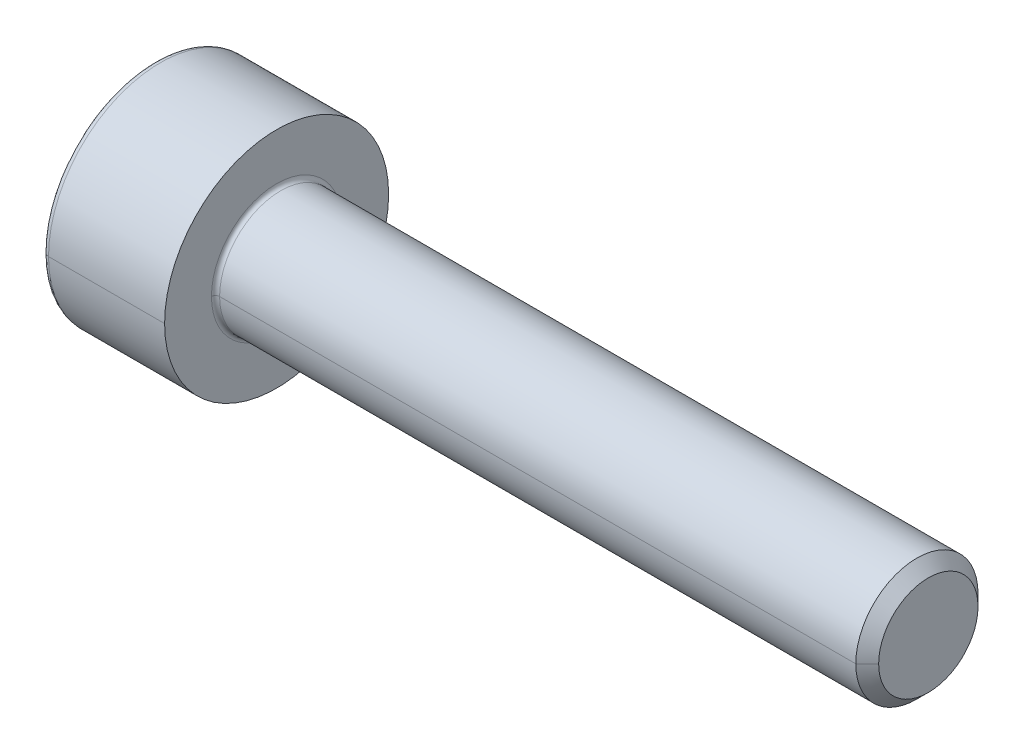
ISO-10303-21;
HEADER;
FILE_DESCRIPTION(('STEP AP214'),'2;1');
FILE_NAME('part.step','',(''),(''),'','','');
FILE_SCHEMA(('AUTOMOTIVE_DESIGN { 1 0 10303 214 1 1 1 1 }'));
ENDSEC;
DATA;
#1=APPLICATION_CONTEXT('core data for automotive mechanical design processes');
#2=APPLICATION_PROTOCOL_DEFINITION('international standard','automotive_design',2000,#1);
#3=PRODUCT_CONTEXT('',#1,'mechanical');
#4=PRODUCT('Part','Part','',(#3));
#5=PRODUCT_RELATED_PRODUCT_CATEGORY('part','',(#4));
#6=PRODUCT_DEFINITION_FORMATION('','',#4);
#7=PRODUCT_DEFINITION_CONTEXT('part definition',#1,'design');
#8=PRODUCT_DEFINITION('design','',#6,#7);
#9=PRODUCT_DEFINITION_SHAPE('','',#8);
#10=(LENGTH_UNIT() NAMED_UNIT(*) SI_UNIT(.MILLI.,.METRE.));
#11=(NAMED_UNIT(*) PLANE_ANGLE_UNIT() SI_UNIT($,.RADIAN.));
#12=(NAMED_UNIT(*) SI_UNIT($,.STERADIAN.) SOLID_ANGLE_UNIT());
#13=UNCERTAINTY_MEASURE_WITH_UNIT(LENGTH_MEASURE(1.E-05),#10,'distance_accuracy_value','');
#14=(GEOMETRIC_REPRESENTATION_CONTEXT(3) GLOBAL_UNCERTAINTY_ASSIGNED_CONTEXT((#13)) GLOBAL_UNIT_ASSIGNED_CONTEXT((#10,
#11,#12)) REPRESENTATION_CONTEXT('',''));
#15=CARTESIAN_POINT('',(0.,0.,0.));
#16=DIRECTION('',(0.,0.,1.));
#17=DIRECTION('',(1.,0.,0.));
#18=AXIS2_PLACEMENT_3D('',#15,#16,#17);
#19=CARTESIAN_POINT('',(1.3,0.,0.));
#20=DIRECTION('',(-1.,0.,0.));
#21=DIRECTION('',(0.,0.,1.));
#22=AXIS2_PLACEMENT_3D('',#19,#20,#21);
#23=CONICAL_SURFACE('',#22,1.28,1.0471975511966);
#24=DIRECTION('',(-0.5,0.,-0.866025403784437));
#25=VECTOR('',#24,1.);
#26=CARTESIAN_POINT('',(1.3,0.,-1.28));
#27=LINE('',#26,#25);
#28=CARTESIAN_POINT('',(2.03900834456273,0.,0.));
#29=VERTEX_POINT('',#28);
#30=CARTESIAN_POINT('',(1.3,0.,-1.28));
#31=VERTEX_POINT('',#30);
#32=EDGE_CURVE('E303',#29,#31,#27,.T.);
#33=ORIENTED_EDGE('',*,*,#32,.F.);
#34=DIRECTION('',(-0.5,0.,0.866025403784437));
#35=VECTOR('',#34,1.);
#36=CARTESIAN_POINT('',(1.3,0.,1.28));
#37=LINE('',#36,#35);
#38=CARTESIAN_POINT('',(1.3,0.,1.28));
#39=VERTEX_POINT('',#38);
#40=EDGE_CURVE('E301',#29,#39,#37,.T.);
#41=ORIENTED_EDGE('',*,*,#40,.T.);
#42=CARTESIAN_POINT('',(1.3,0.,0.));
#43=DIRECTION('',(-1.,0.,0.));
#44=DIRECTION('',(0.,0.,1.));
#45=AXIS2_PLACEMENT_3D('',#42,#43,#44);
#46=CIRCLE('',#45,1.28);
#47=CARTESIAN_POINT('',(1.3,1.10851251684408,0.64));
#48=VERTEX_POINT('',#47);
#49=EDGE_CURVE('E19',#39,#48,#46,.T.);
#50=ORIENTED_EDGE('',*,*,#49,.T.);
#51=CARTESIAN_POINT('',(1.3,0.,0.));
#52=DIRECTION('',(-1.,0.,0.));
#53=DIRECTION('',(0.,0.,1.));
#54=AXIS2_PLACEMENT_3D('',#51,#52,#53);
#55=CIRCLE('',#54,1.28);
#56=CARTESIAN_POINT('',(1.3,1.10851251684408,-0.64));
#57=VERTEX_POINT('',#56);
#58=EDGE_CURVE('E25',#48,#57,#55,.T.);
#59=ORIENTED_EDGE('',*,*,#58,.T.);
#60=CARTESIAN_POINT('',(1.3,0.,0.));
#61=DIRECTION('',(-1.,0.,0.));
#62=DIRECTION('',(0.,0.,1.));
#63=AXIS2_PLACEMENT_3D('',#60,#61,#62);
#64=CIRCLE('',#63,1.28);
#65=EDGE_CURVE('E11',#57,#31,#64,.T.);
#66=ORIENTED_EDGE('',*,*,#65,.T.);
#67=EDGE_LOOP('',(#33,#41,#50,#59,#66));
#68=FACE_BOUND('',#67,.T.);
#69=ADVANCED_FACE('F16',(#68),#23,.F.);
#70=CARTESIAN_POINT('',(1.3,1.47801668912544,0.));
#71=DIRECTION('',(1.,0.,0.));
#72=DIRECTION('',(0.,1.,0.));
#73=AXIS2_PLACEMENT_3D('',#70,#71,#72);
#74=PLANE('',#73);
#75=DIRECTION('',(0.,-0.5,-0.866025403784438));
#76=VECTOR('',#75,1.);
#77=CARTESIAN_POINT('',(1.3,1.47801668912544,0.));
#78=LINE('',#77,#76);
#79=CARTESIAN_POINT('',(1.3,0.739008344562716,-1.28));
#80=VERTEX_POINT('',#79);
#81=EDGE_CURVE('E46',#57,#80,#78,.T.);
#82=ORIENTED_EDGE('',*,*,#81,.T.);
#83=DIRECTION('',(0.,-1.,0.));
#84=VECTOR('',#83,1.);
#85=CARTESIAN_POINT('',(1.3,0.739008344562716,-1.28));
#86=LINE('',#85,#84);
#87=EDGE_CURVE('E193',#80,#31,#86,.T.);
#88=ORIENTED_EDGE('',*,*,#87,.T.);
#89=ORIENTED_EDGE('',*,*,#65,.F.);
#90=EDGE_LOOP('',(#82,#88,#89));
#91=FACE_BOUND('',#90,.T.);
#92=ADVANCED_FACE('F412',(#91),#74,.F.);
#93=CARTESIAN_POINT('',(1.3,1.47801668912544,0.));
#94=DIRECTION('',(1.,0.,0.));
#95=DIRECTION('',(0.,1.,0.));
#96=AXIS2_PLACEMENT_3D('',#93,#94,#95);
#97=PLANE('',#96);
#98=DIRECTION('',(0.,-0.5,0.866025403784439));
#99=VECTOR('',#98,1.);
#100=CARTESIAN_POINT('',(1.3,1.47801668912544,0.));
#101=LINE('',#100,#99);
#102=CARTESIAN_POINT('',(1.3,1.47801668912544,0.));
#103=VERTEX_POINT('',#102);
#104=EDGE_CURVE('E230',#103,#48,#101,.T.);
#105=ORIENTED_EDGE('',*,*,#104,.F.);
#106=DIRECTION('',(0.,-0.5,-0.866025403784438));
#107=VECTOR('',#106,1.);
#108=CARTESIAN_POINT('',(1.3,1.47801668912544,0.));
#109=LINE('',#108,#107);
#110=EDGE_CURVE('E201',#103,#57,#109,.T.);
#111=ORIENTED_EDGE('',*,*,#110,.T.);
#112=ORIENTED_EDGE('',*,*,#58,.F.);
#113=EDGE_LOOP('',(#105,#111,#112));
#114=FACE_BOUND('',#113,.T.);
#115=ADVANCED_FACE('F417',(#114),#97,.F.);
#116=CARTESIAN_POINT('',(1.3,1.47801668912544,0.));
#117=DIRECTION('',(1.,0.,0.));
#118=DIRECTION('',(0.,1.,0.));
#119=AXIS2_PLACEMENT_3D('',#116,#117,#118);
#120=PLANE('',#119);
#121=DIRECTION('',(0.,1.,0.));
#122=VECTOR('',#121,1.);
#123=CARTESIAN_POINT('',(1.3,-0.739008344562723,1.28));
#124=LINE('',#123,#122);
#125=CARTESIAN_POINT('',(1.3,0.739008344562719,1.28));
#126=VERTEX_POINT('',#125);
#127=EDGE_CURVE('E277',#39,#126,#124,.T.);
#128=ORIENTED_EDGE('',*,*,#127,.T.);
#129=DIRECTION('',(0.,-0.5,0.866025403784439));
#130=VECTOR('',#129,1.);
#131=CARTESIAN_POINT('',(1.3,1.47801668912544,0.));
#132=LINE('',#131,#130);
#133=EDGE_CURVE('E234',#48,#126,#132,.T.);
#134=ORIENTED_EDGE('',*,*,#133,.F.);
#135=ORIENTED_EDGE('',*,*,#49,.F.);
#136=EDGE_LOOP('',(#128,#134,#135));
#137=FACE_BOUND('',#136,.T.);
#138=ADVANCED_FACE('F624',(#137),#120,.F.);
#139=CARTESIAN_POINT('',(1.3,1.47801668912544,0.));
#140=DIRECTION('',(1.,0.,0.));
#141=DIRECTION('',(0.,1.,0.));
#142=AXIS2_PLACEMENT_3D('',#139,#140,#141);
#143=PLANE('',#142);
#144=DIRECTION('',(0.,-0.5,-0.866025403784438));
#145=VECTOR('',#144,1.);
#146=CARTESIAN_POINT('',(1.3,-0.739008344562723,1.28));
#147=LINE('',#146,#145);
#148=CARTESIAN_POINT('',(1.3,-0.739008344562723,1.28));
#149=VERTEX_POINT('',#148);
#150=CARTESIAN_POINT('',(1.3,-1.10851251684408,0.64));
#151=VERTEX_POINT('',#150);
#152=EDGE_CURVE('E172',#149,#151,#147,.T.);
#153=ORIENTED_EDGE('',*,*,#152,.F.);
#154=DIRECTION('',(0.,1.,0.));
#155=VECTOR('',#154,1.);
#156=CARTESIAN_POINT('',(1.3,-0.739008344562723,1.28));
#157=LINE('',#156,#155);
#158=EDGE_CURVE('E280',#149,#39,#157,.T.);
#159=ORIENTED_EDGE('',*,*,#158,.T.);
#160=CARTESIAN_POINT('',(1.3,0.,0.));
#161=DIRECTION('',(-1.,0.,0.));
#162=DIRECTION('',(0.,0.,1.));
#163=AXIS2_PLACEMENT_3D('',#160,#161,#162);
#164=CIRCLE('',#163,1.28);
#165=EDGE_CURVE('E304',#151,#39,#164,.T.);
#166=ORIENTED_EDGE('',*,*,#165,.F.);
#167=EDGE_LOOP('',(#153,#159,#166));
#168=FACE_BOUND('',#167,.T.);
#169=ADVANCED_FACE('F430',(#168),#143,.F.);
#170=CARTESIAN_POINT('',(1.3,1.47801668912544,0.));
#171=DIRECTION('',(1.,0.,0.));
#172=DIRECTION('',(0.,1.,0.));
#173=AXIS2_PLACEMENT_3D('',#170,#171,#172);
#174=PLANE('',#173);
#175=DIRECTION('',(0.,0.5,-0.866025403784439));
#176=VECTOR('',#175,1.);
#177=CARTESIAN_POINT('',(1.3,-1.47801668912544,0.));
#178=LINE('',#177,#176);
#179=CARTESIAN_POINT('',(1.3,-1.47801668912544,0.));
#180=VERTEX_POINT('',#179);
#181=CARTESIAN_POINT('',(1.3,-1.10851251684409,-0.64));
#182=VERTEX_POINT('',#181);
#183=EDGE_CURVE('E145',#180,#182,#178,.T.);
#184=ORIENTED_EDGE('',*,*,#183,.F.);
#185=DIRECTION('',(0.,-0.5,-0.866025403784438));
#186=VECTOR('',#185,1.);
#187=CARTESIAN_POINT('',(1.3,-0.739008344562723,1.28));
#188=LINE('',#187,#186);
#189=EDGE_CURVE('E149',#151,#180,#188,.T.);
#190=ORIENTED_EDGE('',*,*,#189,.F.);
#191=CARTESIAN_POINT('',(1.3,0.,0.));
#192=DIRECTION('',(-1.,0.,0.));
#193=DIRECTION('',(0.,0.,1.));
#194=AXIS2_PLACEMENT_3D('',#191,#192,#193);
#195=CIRCLE('',#194,1.28);
#196=EDGE_CURVE('E153',#182,#151,#195,.T.);
#197=ORIENTED_EDGE('',*,*,#196,.F.);
#198=EDGE_LOOP('',(#184,#190,#197));
#199=FACE_BOUND('',#198,.T.);
#200=ADVANCED_FACE('F147',(#199),#174,.F.);
#201=CARTESIAN_POINT('',(1.3,1.47801668912544,0.));
#202=DIRECTION('',(1.,0.,0.));
#203=DIRECTION('',(0.,1.,0.));
#204=AXIS2_PLACEMENT_3D('',#201,#202,#203);
#205=PLANE('',#204);
#206=DIRECTION('',(0.,-1.,0.));
#207=VECTOR('',#206,1.);
#208=CARTESIAN_POINT('',(1.3,0.739008344562716,-1.28));
#209=LINE('',#208,#207);
#210=CARTESIAN_POINT('',(1.3,-0.739008344562726,-1.28));
#211=VERTEX_POINT('',#210);
#212=EDGE_CURVE('E190',#31,#211,#209,.T.);
#213=ORIENTED_EDGE('',*,*,#212,.T.);
#214=DIRECTION('',(0.,0.5,-0.866025403784439));
#215=VECTOR('',#214,1.);
#216=CARTESIAN_POINT('',(1.3,-1.47801668912544,0.));
#217=LINE('',#216,#215);
#218=EDGE_CURVE('E158',#182,#211,#217,.T.);
#219=ORIENTED_EDGE('',*,*,#218,.F.);
#220=CARTESIAN_POINT('',(1.3,0.,0.));
#221=DIRECTION('',(-1.,0.,0.));
#222=DIRECTION('',(0.,0.,1.));
#223=AXIS2_PLACEMENT_3D('',#220,#221,#222);
#224=CIRCLE('',#223,1.28);
#225=EDGE_CURVE('E312',#31,#182,#224,.T.);
#226=ORIENTED_EDGE('',*,*,#225,.F.);
#227=EDGE_LOOP('',(#213,#219,#226));
#228=FACE_BOUND('',#227,.T.);
#229=ADVANCED_FACE('F641',(#228),#205,.F.);
#230=CARTESIAN_POINT('',(1.3,1.47801668912544,0.));
#231=DIRECTION('',(0.,0.866025403784438,-0.5));
#232=DIRECTION('',(-1.,0.,0.));
#233=AXIS2_PLACEMENT_3D('',#230,#231,#232);
#234=PLANE('',#233);
#235=DIRECTION('',(0.,-0.5,-0.866025403784438));
#236=VECTOR('',#235,1.);
#237=CARTESIAN_POINT('',(0.,1.47801668912544,0.));
#238=LINE('',#237,#236);
#239=CARTESIAN_POINT('',(0.,1.47801668912544,0.));
#240=VERTEX_POINT('',#239);
#241=CARTESIAN_POINT('',(0.,0.739008344562716,-1.28));
#242=VERTEX_POINT('',#241);
#243=EDGE_CURVE('E252',#240,#242,#238,.T.);
#244=ORIENTED_EDGE('',*,*,#243,.T.);
#245=DIRECTION('',(-1.,0.,0.));
#246=VECTOR('',#245,1.);
#247=CARTESIAN_POINT('',(1.3,0.739008344562716,-1.28));
#248=LINE('',#247,#246);
#249=EDGE_CURVE('E196',#80,#242,#248,.T.);
#250=ORIENTED_EDGE('',*,*,#249,.F.);
#251=ORIENTED_EDGE('',*,*,#81,.F.);
#252=ORIENTED_EDGE('',*,*,#110,.F.);
#253=DIRECTION('',(-1.,0.,0.));
#254=VECTOR('',#253,1.);
#255=CARTESIAN_POINT('',(1.3,1.47801668912544,0.));
#256=LINE('',#255,#254);
#257=EDGE_CURVE('E235',#103,#240,#256,.T.);
#258=ORIENTED_EDGE('',*,*,#257,.T.);
#259=EDGE_LOOP('',(#244,#250,#251,#252,#258));
#260=FACE_BOUND('',#259,.T.);
#261=ADVANCED_FACE('F650',(#260),#234,.F.);
#262=CARTESIAN_POINT('',(1.3,0.739008344562716,-1.28));
#263=DIRECTION('',(0.,0.,-1.));
#264=DIRECTION('',(0.,-1.,0.));
#265=AXIS2_PLACEMENT_3D('',#262,#263,#264);
#266=PLANE('',#265);
#267=DIRECTION('',(0.,-1.,0.));
#268=VECTOR('',#267,1.);
#269=CARTESIAN_POINT('',(0.,0.739008344562716,-1.28));
#270=LINE('',#269,#268);
#271=CARTESIAN_POINT('',(0.,-0.739008344562726,-1.28));
#272=VERTEX_POINT('',#271);
#273=EDGE_CURVE('E248',#242,#272,#270,.T.);
#274=ORIENTED_EDGE('',*,*,#273,.T.);
#275=DIRECTION('',(-1.,0.,0.));
#276=VECTOR('',#275,1.);
#277=CARTESIAN_POINT('',(1.3,-0.739008344562726,-1.28));
#278=LINE('',#277,#276);
#279=EDGE_CURVE('E187',#211,#272,#278,.T.);
#280=ORIENTED_EDGE('',*,*,#279,.F.);
#281=ORIENTED_EDGE('',*,*,#212,.F.);
#282=ORIENTED_EDGE('',*,*,#87,.F.);
#283=ORIENTED_EDGE('',*,*,#249,.T.);
#284=EDGE_LOOP('',(#274,#280,#281,#282,#283));
#285=FACE_BOUND('',#284,.T.);
#286=ADVANCED_FACE('F656',(#285),#266,.F.);
#287=CARTESIAN_POINT('',(1.3,-1.47801668912544,0.));
#288=DIRECTION('',(0.,0.866025403784439,0.5));
#289=DIRECTION('',(1.,0.,0.));
#290=AXIS2_PLACEMENT_3D('',#287,#288,#289);
#291=PLANE('',#290);
#292=DIRECTION('',(0.,0.5,-0.866025403784439));
#293=VECTOR('',#292,1.);
#294=CARTESIAN_POINT('',(0.,-1.47801668912544,0.));
#295=LINE('',#294,#293);
#296=CARTESIAN_POINT('',(0.,-1.47801668912544,0.));
#297=VERTEX_POINT('',#296);
#298=EDGE_CURVE('E164',#297,#272,#295,.T.);
#299=ORIENTED_EDGE('',*,*,#298,.F.);
#300=DIRECTION('',(-1.,0.,0.));
#301=VECTOR('',#300,1.);
#302=CARTESIAN_POINT('',(1.3,-1.47801668912544,0.));
#303=LINE('',#302,#301);
#304=EDGE_CURVE('E159',#180,#297,#303,.T.);
#305=ORIENTED_EDGE('',*,*,#304,.F.);
#306=ORIENTED_EDGE('',*,*,#183,.T.);
#307=ORIENTED_EDGE('',*,*,#218,.T.);
#308=ORIENTED_EDGE('',*,*,#279,.T.);
#309=EDGE_LOOP('',(#299,#305,#306,#307,#308));
#310=FACE_BOUND('',#309,.T.);
#311=ADVANCED_FACE('F162',(#310),#291,.T.);
#312=CARTESIAN_POINT('',(1.3,-0.739008344562723,1.28));
#313=DIRECTION('',(0.,0.866025403784438,-0.5));
#314=DIRECTION('',(-1.,0.,0.));
#315=AXIS2_PLACEMENT_3D('',#312,#313,#314);
#316=PLANE('',#315);
#317=DIRECTION('',(0.,-0.5,-0.866025403784438));
#318=VECTOR('',#317,1.);
#319=CARTESIAN_POINT('',(0.,-0.739008344562723,1.28));
#320=LINE('',#319,#318);
#321=CARTESIAN_POINT('',(0.,-0.739008344562723,1.28));
#322=VERTEX_POINT('',#321);
#323=EDGE_CURVE('E243',#322,#297,#320,.T.);
#324=ORIENTED_EDGE('',*,*,#323,.F.);
#325=DIRECTION('',(-1.,0.,0.));
#326=VECTOR('',#325,1.);
#327=CARTESIAN_POINT('',(1.3,-0.739008344562723,1.28));
#328=LINE('',#327,#326);
#329=EDGE_CURVE('E181',#149,#322,#328,.T.);
#330=ORIENTED_EDGE('',*,*,#329,.F.);
#331=ORIENTED_EDGE('',*,*,#152,.T.);
#332=ORIENTED_EDGE('',*,*,#189,.T.);
#333=ORIENTED_EDGE('',*,*,#304,.T.);
#334=EDGE_LOOP('',(#324,#330,#331,#332,#333));
#335=FACE_BOUND('',#334,.T.);
#336=ADVANCED_FACE('F170',(#335),#316,.T.);
#337=CARTESIAN_POINT('',(1.3,-0.739008344562723,1.28));
#338=DIRECTION('',(0.,0.,1.));
#339=DIRECTION('',(0.,-1.,0.));
#340=AXIS2_PLACEMENT_3D('',#337,#338,#339);
#341=PLANE('',#340);
#342=DIRECTION('',(0.,1.,0.));
#343=VECTOR('',#342,1.);
#344=CARTESIAN_POINT('',(0.,-0.739008344562723,1.28));
#345=LINE('',#344,#343);
#346=CARTESIAN_POINT('',(0.,0.739008344562719,1.28));
#347=VERTEX_POINT('',#346);
#348=EDGE_CURVE('E239',#322,#347,#345,.T.);
#349=ORIENTED_EDGE('',*,*,#348,.T.);
#350=DIRECTION('',(-1.,0.,0.));
#351=VECTOR('',#350,1.);
#352=CARTESIAN_POINT('',(1.3,0.739008344562719,1.28));
#353=LINE('',#352,#351);
#354=EDGE_CURVE('E276',#126,#347,#353,.T.);
#355=ORIENTED_EDGE('',*,*,#354,.F.);
#356=ORIENTED_EDGE('',*,*,#127,.F.);
#357=ORIENTED_EDGE('',*,*,#158,.F.);
#358=ORIENTED_EDGE('',*,*,#329,.T.);
#359=EDGE_LOOP('',(#349,#355,#356,#357,#358));
#360=FACE_BOUND('',#359,.T.);
#361=ADVANCED_FACE('F677',(#360),#341,.F.);
#362=CARTESIAN_POINT('',(1.3,1.47801668912544,0.));
#363=DIRECTION('',(0.,-0.866025403784439,-0.5));
#364=DIRECTION('',(0.,0.5,-0.866025403784439));
#365=AXIS2_PLACEMENT_3D('',#362,#363,#364);
#366=PLANE('',#365);
#367=DIRECTION('',(0.,-0.5,0.866025403784439));
#368=VECTOR('',#367,1.);
#369=CARTESIAN_POINT('',(0.,1.47801668912544,0.));
#370=LINE('',#369,#368);
#371=EDGE_CURVE('E229',#240,#347,#370,.T.);
#372=ORIENTED_EDGE('',*,*,#371,.F.);
#373=ORIENTED_EDGE('',*,*,#257,.F.);
#374=ORIENTED_EDGE('',*,*,#104,.T.);
#375=ORIENTED_EDGE('',*,*,#133,.T.);
#376=ORIENTED_EDGE('',*,*,#354,.T.);
#377=EDGE_LOOP('',(#372,#373,#374,#375,#376));
#378=FACE_BOUND('',#377,.T.);
#379=ADVANCED_FACE('F743',(#378),#366,.T.);
#380=CARTESIAN_POINT('',(0.149999999999997,0.,0.));
#381=DIRECTION('',(-1.,0.,0.));
#382=DIRECTION('',(0.,0.,1.));
#383=AXIS2_PLACEMENT_3D('',#380,#381,#382);
#384=TOROIDAL_SURFACE('',#383,2.6,0.15);
#385=CARTESIAN_POINT('',(0.149999999999997,0.,-2.6));
#386=DIRECTION('',(0.,1.,0.));
#387=DIRECTION('',(0.,0.,1.));
#388=AXIS2_PLACEMENT_3D('',#385,#386,#387);
#389=CIRCLE('',#388,0.15);
#390=CARTESIAN_POINT('',(0.149999999999997,0.,-2.75));
#391=VERTEX_POINT('',#390);
#392=CARTESIAN_POINT('',(0.,0.,-2.6));
#393=VERTEX_POINT('',#392);
#394=EDGE_CURVE('E339',#391,#393,#389,.T.);
#395=ORIENTED_EDGE('',*,*,#394,.F.);
#396=CARTESIAN_POINT('',(0.149999999999997,0.,0.));
#397=DIRECTION('',(1.,0.,0.));
#398=DIRECTION('',(0.,0.,1.));
#399=AXIS2_PLACEMENT_3D('',#396,#397,#398);
#400=CIRCLE('',#399,2.75);
#401=CARTESIAN_POINT('',(0.149999999999997,0.,2.75));
#402=VERTEX_POINT('',#401);
#403=EDGE_CURVE('E259',#402,#391,#400,.T.);
#404=ORIENTED_EDGE('',*,*,#403,.F.);
#405=CARTESIAN_POINT('',(0.149999999999997,0.,2.6));
#406=DIRECTION('',(0.,-1.,0.));
#407=DIRECTION('',(0.,0.,-1.));
#408=AXIS2_PLACEMENT_3D('',#405,#406,#407);
#409=CIRCLE('',#408,0.15);
#410=CARTESIAN_POINT('',(0.,0.,2.6));
#411=VERTEX_POINT('',#410);
#412=EDGE_CURVE('E346',#402,#411,#409,.T.);
#413=ORIENTED_EDGE('',*,*,#412,.T.);
#414=CARTESIAN_POINT('',(0.,0.,0.));
#415=DIRECTION('',(-1.,0.,0.));
#416=DIRECTION('',(0.,0.,1.));
#417=AXIS2_PLACEMENT_3D('',#414,#415,#416);
#418=CIRCLE('',#417,2.6);
#419=EDGE_CURVE('E227',#393,#411,#418,.T.);
#420=ORIENTED_EDGE('',*,*,#419,.F.);
#421=EDGE_LOOP('',(#395,#404,#413,#420));
#422=FACE_BOUND('',#421,.T.);
#423=ADVANCED_FACE('F699',(#422),#384,.T.);
#424=CARTESIAN_POINT('',(3.1,0.,0.));
#425=DIRECTION('',(1.,0.,0.));
#426=DIRECTION('',(0.,0.,-1.));
#427=AXIS2_PLACEMENT_3D('',#424,#425,#426);
#428=TOROIDAL_SURFACE('',#427,1.6,0.1);
#429=CARTESIAN_POINT('',(3.1,0.,1.6));
#430=DIRECTION('',(0.,1.,0.));
#431=DIRECTION('',(0.,0.,1.));
#432=AXIS2_PLACEMENT_3D('',#429,#430,#431);
#433=CIRCLE('',#432,0.1);
#434=CARTESIAN_POINT('',(3.1,0.,1.5));
#435=VERTEX_POINT('',#434);
#436=CARTESIAN_POINT('',(3.,0.,1.6));
#437=VERTEX_POINT('',#436);
#438=EDGE_CURVE('E338',#435,#437,#433,.T.);
#439=ORIENTED_EDGE('',*,*,#438,.F.);
#440=CARTESIAN_POINT('',(3.1,0.,0.));
#441=DIRECTION('',(1.,0.,0.));
#442=DIRECTION('',(0.,0.,-1.));
#443=AXIS2_PLACEMENT_3D('',#440,#441,#442);
#444=CIRCLE('',#443,1.5);
#445=CARTESIAN_POINT('',(3.1,0.,-1.5));
#446=VERTEX_POINT('',#445);
#447=EDGE_CURVE('E328',#446,#435,#444,.T.);
#448=ORIENTED_EDGE('',*,*,#447,.F.);
#449=CARTESIAN_POINT('',(3.1,0.,-1.6));
#450=DIRECTION('',(0.,-1.,0.));
#451=DIRECTION('',(0.,0.,-1.));
#452=AXIS2_PLACEMENT_3D('',#449,#450,#451);
#453=CIRCLE('',#452,0.1);
#454=CARTESIAN_POINT('',(3.,0.,-1.6));
#455=VERTEX_POINT('',#454);
#456=EDGE_CURVE('E313',#446,#455,#453,.T.);
#457=ORIENTED_EDGE('',*,*,#456,.T.);
#458=CARTESIAN_POINT('',(3.,0.,0.));
#459=DIRECTION('',(-1.,0.,0.));
#460=DIRECTION('',(0.,0.,-1.));
#461=AXIS2_PLACEMENT_3D('',#458,#459,#460);
#462=CIRCLE('',#461,1.6);
#463=EDGE_CURVE('E263',#437,#455,#462,.T.);
#464=ORIENTED_EDGE('',*,*,#463,.F.);
#465=EDGE_LOOP('',(#439,#448,#457,#464));
#466=FACE_BOUND('',#465,.T.);
#467=ADVANCED_FACE('F695',(#466),#428,.F.);
#468=CARTESIAN_POINT('',(19.,1.2195,0.));
#469=DIRECTION('',(1.,0.,0.));
#470=DIRECTION('',(0.,1.,0.));
#471=AXIS2_PLACEMENT_3D('',#468,#469,#470);
#472=PLANE('',#471);
#473=CARTESIAN_POINT('',(19.,0.,0.));
#474=DIRECTION('',(-1.,0.,0.));
#475=DIRECTION('',(0.,0.,1.));
#476=AXIS2_PLACEMENT_3D('',#473,#474,#475);
#477=CIRCLE('',#476,1.2195);
#478=CARTESIAN_POINT('',(19.,0.,1.2195));
#479=VERTEX_POINT('',#478);
#480=CARTESIAN_POINT('',(19.,0.,-1.2195));
#481=VERTEX_POINT('',#480);
#482=EDGE_CURVE('E317',#479,#481,#477,.T.);
#483=ORIENTED_EDGE('',*,*,#482,.F.);
#484=CARTESIAN_POINT('',(19.,0.,0.));
#485=DIRECTION('',(-1.,0.,0.));
#486=DIRECTION('',(0.,0.,1.));
#487=AXIS2_PLACEMENT_3D('',#484,#485,#486);
#488=CIRCLE('',#487,1.2195);
#489=EDGE_CURVE('E269',#481,#479,#488,.T.);
#490=ORIENTED_EDGE('',*,*,#489,.F.);
#491=EDGE_LOOP('',(#483,#490));
#492=FACE_BOUND('',#491,.T.);
#493=ADVANCED_FACE('F688',(#492),#472,.T.);
#494=CARTESIAN_POINT('',(19.,0.,0.));
#495=DIRECTION('',(-1.,0.,0.));
#496=DIRECTION('',(0.,0.,1.));
#497=AXIS2_PLACEMENT_3D('',#494,#495,#496);
#498=CONICAL_SURFACE('',#497,1.2195,0.785398163397378);
#499=DIRECTION('',(-0.707106781186597,0.,-0.707106781186498));
#500=VECTOR('',#499,1.);
#501=CARTESIAN_POINT('',(19.,0.,-1.2195));
#502=LINE('',#501,#500);
#503=CARTESIAN_POINT('',(18.7195,0.,-1.49999999999998));
#504=VERTEX_POINT('',#503);
#505=EDGE_CURVE('E357',#481,#504,#502,.T.);
#506=ORIENTED_EDGE('',*,*,#505,.F.);
#507=ORIENTED_EDGE('',*,*,#489,.T.);
#508=DIRECTION('',(-0.707106781186597,0.,0.707106781186498));
#509=VECTOR('',#508,1.);
#510=CARTESIAN_POINT('',(19.,0.,1.2195));
#511=LINE('',#510,#509);
#512=CARTESIAN_POINT('',(18.7195,0.,1.49999999999998));
#513=VERTEX_POINT('',#512);
#514=EDGE_CURVE('E329',#479,#513,#511,.T.);
#515=ORIENTED_EDGE('',*,*,#514,.T.);
#516=CARTESIAN_POINT('',(18.7195,0.,0.));
#517=DIRECTION('',(-1.,0.,0.));
#518=DIRECTION('',(0.,0.,1.));
#519=AXIS2_PLACEMENT_3D('',#516,#517,#518);
#520=CIRCLE('',#519,1.49999999999998);
#521=EDGE_CURVE('E266',#504,#513,#520,.T.);
#522=ORIENTED_EDGE('',*,*,#521,.F.);
#523=EDGE_LOOP('',(#506,#507,#515,#522));
#524=FACE_BOUND('',#523,.T.);
#525=ADVANCED_FACE('F683',(#524),#498,.T.);
#526=CARTESIAN_POINT('',(-31.75,0.,0.));
#527=DIRECTION('',(-1.,0.,0.));
#528=DIRECTION('',(0.,0.,1.));
#529=AXIS2_PLACEMENT_3D('',#526,#527,#528);
#530=CYLINDRICAL_SURFACE('',#529,1.5);
#531=DIRECTION('',(-1.,0.,0.));
#532=VECTOR('',#531,1.);
#533=CARTESIAN_POINT('',(-31.75,0.,-1.5));
#534=LINE('',#533,#532);
#535=EDGE_CURVE('E333',#504,#446,#534,.T.);
#536=ORIENTED_EDGE('',*,*,#535,.F.);
#537=ORIENTED_EDGE('',*,*,#521,.T.);
#538=DIRECTION('',(-1.,0.,0.));
#539=VECTOR('',#538,1.);
#540=CARTESIAN_POINT('',(-31.75,0.,1.5));
#541=LINE('',#540,#539);
#542=EDGE_CURVE('E323',#513,#435,#541,.T.);
#543=ORIENTED_EDGE('',*,*,#542,.T.);
#544=CARTESIAN_POINT('',(3.1,0.,0.));
#545=DIRECTION('',(1.,0.,0.));
#546=DIRECTION('',(0.,0.,-1.));
#547=AXIS2_PLACEMENT_3D('',#544,#545,#546);
#548=CIRCLE('',#547,1.5);
#549=EDGE_CURVE('E349',#435,#446,#548,.T.);
#550=ORIENTED_EDGE('',*,*,#549,.T.);
#551=EDGE_LOOP('',(#536,#537,#543,#550));
#552=FACE_BOUND('',#551,.T.);
#553=ADVANCED_FACE('F687',(#552),#530,.T.);
#554=CARTESIAN_POINT('',(3.,2.75,0.));
#555=DIRECTION('',(1.,0.,0.));
#556=DIRECTION('',(0.,1.,0.));
#557=AXIS2_PLACEMENT_3D('',#554,#555,#556);
#558=PLANE('',#557);
#559=CARTESIAN_POINT('',(3.,0.,0.));
#560=DIRECTION('',(-1.,0.,0.));
#561=DIRECTION('',(0.,0.,-1.));
#562=AXIS2_PLACEMENT_3D('',#559,#560,#561);
#563=CIRCLE('',#562,1.6);
#564=EDGE_CURVE('E318',#455,#437,#563,.T.);
#565=ORIENTED_EDGE('',*,*,#564,.T.);
#566=ORIENTED_EDGE('',*,*,#463,.T.);
#567=EDGE_LOOP('',(#565,#566));
#568=FACE_BOUND('',#567,.T.);
#569=CARTESIAN_POINT('',(3.,0.,0.));
#570=DIRECTION('',(-1.,0.,0.));
#571=DIRECTION('',(0.,0.,1.));
#572=AXIS2_PLACEMENT_3D('',#569,#570,#571);
#573=CIRCLE('',#572,2.75);
#574=CARTESIAN_POINT('',(3.,0.,2.75));
#575=VERTEX_POINT('',#574);
#576=CARTESIAN_POINT('',(3.,0.,-2.75));
#577=VERTEX_POINT('',#576);
#578=EDGE_CURVE('E327',#575,#577,#573,.T.);
#579=ORIENTED_EDGE('',*,*,#578,.F.);
#580=CARTESIAN_POINT('',(3.,0.,0.));
#581=DIRECTION('',(-1.,0.,0.));
#582=DIRECTION('',(0.,0.,1.));
#583=AXIS2_PLACEMENT_3D('',#580,#581,#582);
#584=CIRCLE('',#583,2.75);
#585=EDGE_CURVE('E256',#577,#575,#584,.T.);
#586=ORIENTED_EDGE('',*,*,#585,.F.);
#587=EDGE_LOOP('',(#579,#586));
#588=FACE_BOUND('',#587,.T.);
#589=ADVANCED_FACE('F706',(#568,#588),#558,.T.);
#590=CARTESIAN_POINT('',(-31.75,0.,0.));
#591=DIRECTION('',(-1.,0.,0.));
#592=DIRECTION('',(0.,0.,1.));
#593=AXIS2_PLACEMENT_3D('',#590,#591,#592);
#594=CYLINDRICAL_SURFACE('',#593,2.75);
#595=DIRECTION('',(-1.,0.,0.));
#596=VECTOR('',#595,1.);
#597=CARTESIAN_POINT('',(-31.75,0.,-2.75));
#598=LINE('',#597,#596);
#599=EDGE_CURVE('E372',#577,#391,#598,.T.);
#600=ORIENTED_EDGE('',*,*,#599,.F.);
#601=ORIENTED_EDGE('',*,*,#585,.T.);
#602=DIRECTION('',(-1.,0.,0.));
#603=VECTOR('',#602,1.);
#604=CARTESIAN_POINT('',(-31.75,0.,2.75));
#605=LINE('',#604,#603);
#606=EDGE_CURVE('E225',#575,#402,#605,.T.);
#607=ORIENTED_EDGE('',*,*,#606,.T.);
#608=ORIENTED_EDGE('',*,*,#403,.T.);
#609=EDGE_LOOP('',(#600,#601,#607,#608));
#610=FACE_BOUND('',#609,.T.);
#611=ADVANCED_FACE('F386',(#610),#594,.T.);
#612=CARTESIAN_POINT('',(0.,0.,0.));
#613=DIRECTION('',(-1.,0.,0.));
#614=DIRECTION('',(0.,0.,1.));
#615=AXIS2_PLACEMENT_3D('',#612,#613,#614);
#616=PLANE('',#615);
#617=ORIENTED_EDGE('',*,*,#371,.T.);
#618=ORIENTED_EDGE('',*,*,#348,.F.);
#619=ORIENTED_EDGE('',*,*,#323,.T.);
#620=ORIENTED_EDGE('',*,*,#298,.T.);
#621=ORIENTED_EDGE('',*,*,#273,.F.);
#622=ORIENTED_EDGE('',*,*,#243,.F.);
#623=EDGE_LOOP('',(#617,#618,#619,#620,#621,#622));
#624=FACE_BOUND('',#623,.T.);
#625=CARTESIAN_POINT('',(0.,0.,0.));
#626=DIRECTION('',(-1.,0.,0.));
#627=DIRECTION('',(0.,0.,1.));
#628=AXIS2_PLACEMENT_3D('',#625,#626,#627);
#629=CIRCLE('',#628,2.6);
#630=EDGE_CURVE('E299',#411,#393,#629,.T.);
#631=ORIENTED_EDGE('',*,*,#630,.T.);
#632=ORIENTED_EDGE('',*,*,#419,.T.);
#633=EDGE_LOOP('',(#631,#632));
#634=FACE_BOUND('',#633,.T.);
#635=ADVANCED_FACE('F398',(#624,#634),#616,.T.);
#636=CARTESIAN_POINT('',(-31.75,0.,0.));
#637=DIRECTION('',(-1.,0.,0.));
#638=DIRECTION('',(0.,0.,1.));
#639=AXIS2_PLACEMENT_3D('',#636,#637,#638);
#640=CYLINDRICAL_SURFACE('',#639,2.75);
#641=ORIENTED_EDGE('',*,*,#578,.T.);
#642=ORIENTED_EDGE('',*,*,#599,.T.);
#643=CARTESIAN_POINT('',(0.149999999999997,0.,0.));
#644=DIRECTION('',(1.,0.,0.));
#645=DIRECTION('',(0.,0.,1.));
#646=AXIS2_PLACEMENT_3D('',#643,#644,#645);
#647=CIRCLE('',#646,2.75);
#648=EDGE_CURVE('E308',#391,#402,#647,.T.);
#649=ORIENTED_EDGE('',*,*,#648,.T.);
#650=ORIENTED_EDGE('',*,*,#606,.F.);
#651=EDGE_LOOP('',(#641,#642,#649,#650));
#652=FACE_BOUND('',#651,.T.);
#653=ADVANCED_FACE('F395',(#652),#640,.T.);
#654=CARTESIAN_POINT('',(-31.75,0.,0.));
#655=DIRECTION('',(-1.,0.,0.));
#656=DIRECTION('',(0.,0.,1.));
#657=AXIS2_PLACEMENT_3D('',#654,#655,#656);
#658=CYLINDRICAL_SURFACE('',#657,1.5);
#659=CARTESIAN_POINT('',(18.7195,0.,0.));
#660=DIRECTION('',(-1.,0.,0.));
#661=DIRECTION('',(0.,0.,1.));
#662=AXIS2_PLACEMENT_3D('',#659,#660,#661);
#663=CIRCLE('',#662,1.49999999999998);
#664=EDGE_CURVE('E334',#513,#504,#663,.T.);
#665=ORIENTED_EDGE('',*,*,#664,.T.);
#666=ORIENTED_EDGE('',*,*,#535,.T.);
#667=ORIENTED_EDGE('',*,*,#447,.T.);
#668=ORIENTED_EDGE('',*,*,#542,.F.);
#669=EDGE_LOOP('',(#665,#666,#667,#668));
#670=FACE_BOUND('',#669,.T.);
#671=ADVANCED_FACE('F397',(#670),#658,.T.);
#672=CARTESIAN_POINT('',(19.,0.,0.));
#673=DIRECTION('',(-1.,0.,0.));
#674=DIRECTION('',(0.,0.,1.));
#675=AXIS2_PLACEMENT_3D('',#672,#673,#674);
#676=CONICAL_SURFACE('',#675,1.2195,0.785398163397378);
#677=ORIENTED_EDGE('',*,*,#482,.T.);
#678=ORIENTED_EDGE('',*,*,#505,.T.);
#679=ORIENTED_EDGE('',*,*,#664,.F.);
#680=ORIENTED_EDGE('',*,*,#514,.F.);
#681=EDGE_LOOP('',(#677,#678,#679,#680));
#682=FACE_BOUND('',#681,.T.);
#683=ADVANCED_FACE('F406',(#682),#676,.T.);
#684=CARTESIAN_POINT('',(3.1,0.,0.));
#685=DIRECTION('',(1.,0.,0.));
#686=DIRECTION('',(0.,0.,-1.));
#687=AXIS2_PLACEMENT_3D('',#684,#685,#686);
#688=TOROIDAL_SURFACE('',#687,1.6,0.1);
#689=ORIENTED_EDGE('',*,*,#549,.F.);
#690=ORIENTED_EDGE('',*,*,#438,.T.);
#691=ORIENTED_EDGE('',*,*,#564,.F.);
#692=ORIENTED_EDGE('',*,*,#456,.F.);
#693=EDGE_LOOP('',(#689,#690,#691,#692));
#694=FACE_BOUND('',#693,.T.);
#695=ADVANCED_FACE('F753',(#694),#688,.F.);
#696=CARTESIAN_POINT('',(0.149999999999997,0.,0.));
#697=DIRECTION('',(-1.,0.,0.));
#698=DIRECTION('',(0.,0.,1.));
#699=AXIS2_PLACEMENT_3D('',#696,#697,#698);
#700=TOROIDAL_SURFACE('',#699,2.6,0.15);
#701=ORIENTED_EDGE('',*,*,#648,.F.);
#702=ORIENTED_EDGE('',*,*,#394,.T.);
#703=ORIENTED_EDGE('',*,*,#630,.F.);
#704=ORIENTED_EDGE('',*,*,#412,.F.);
#705=EDGE_LOOP('',(#701,#702,#703,#704));
#706=FACE_BOUND('',#705,.T.);
#707=ADVANCED_FACE('F391',(#706),#700,.T.);
#708=CARTESIAN_POINT('',(1.3,0.,0.));
#709=DIRECTION('',(-1.,0.,0.));
#710=DIRECTION('',(0.,0.,1.));
#711=AXIS2_PLACEMENT_3D('',#708,#709,#710);
#712=CONICAL_SURFACE('',#711,1.28,1.0471975511966);
#713=ORIENTED_EDGE('',*,*,#40,.F.);
#714=ORIENTED_EDGE('',*,*,#32,.T.);
#715=ORIENTED_EDGE('',*,*,#225,.T.);
#716=ORIENTED_EDGE('',*,*,#196,.T.);
#717=ORIENTED_EDGE('',*,*,#165,.T.);
#718=EDGE_LOOP('',(#713,#714,#715,#716,#717));
#719=FACE_BOUND('',#718,.T.);
#720=ADVANCED_FACE('F426',(#719),#712,.F.);
#721=CLOSED_SHELL('',(#69,#92,#115,#138,#169,#200,#229,#261,#286,#311,#336,#361,#379,#423,#467,
#493,#525,#553,#589,#611,#635,#653,#671,#683,#695,#707,#720));
#722=MANIFOLD_SOLID_BREP('B1',#721);
#723=ADVANCED_BREP_SHAPE_REPRESENTATION('',(#18,#722),#14);
#724=SHAPE_DEFINITION_REPRESENTATION(#9,#723);
ENDSEC;
END-ISO-10303-21;
